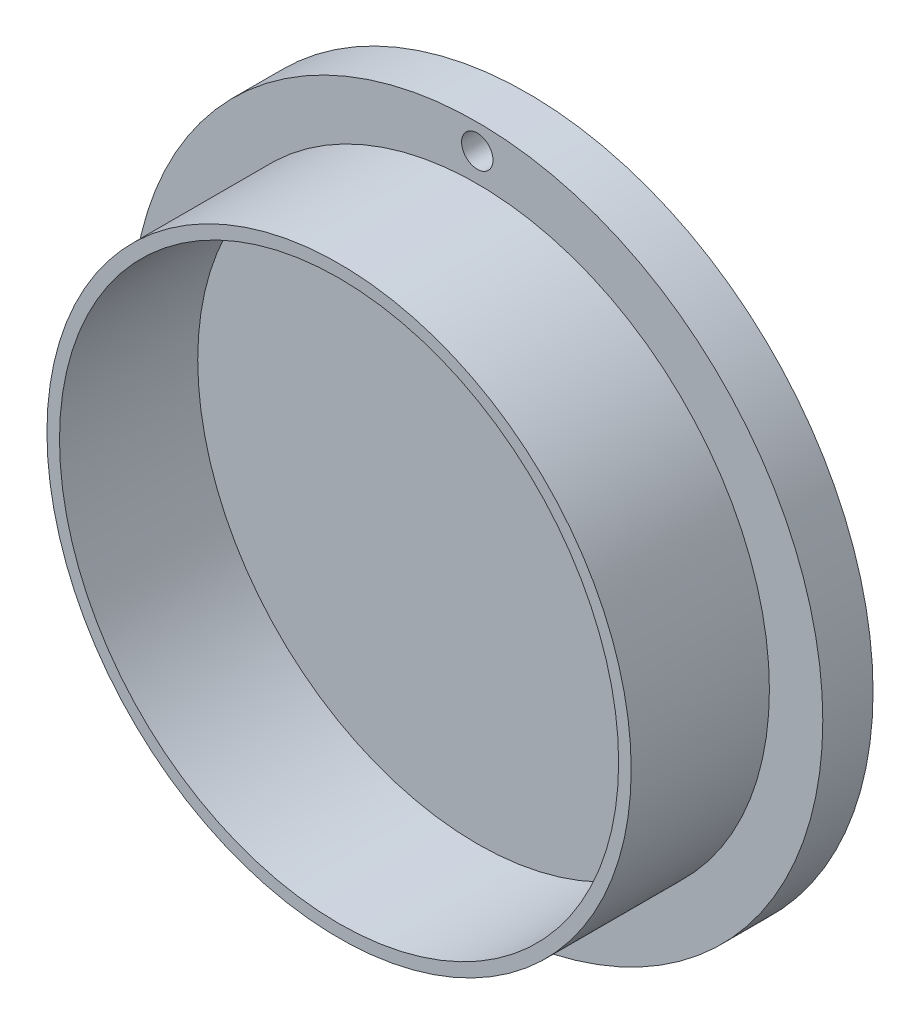
ISO-10303-21;
HEADER;
FILE_DESCRIPTION(('STEP AP214'),'2;1');
FILE_NAME('part.step','',(''),(''),'','','');
FILE_SCHEMA(('AUTOMOTIVE_DESIGN { 1 0 10303 214 1 1 1 1 }'));
ENDSEC;
DATA;
#1=APPLICATION_CONTEXT('core data for automotive mechanical design processes');
#2=APPLICATION_PROTOCOL_DEFINITION('international standard','automotive_design',2000,#1);
#3=PRODUCT_CONTEXT('',#1,'mechanical');
#4=PRODUCT('Part','Part','',(#3));
#5=PRODUCT_RELATED_PRODUCT_CATEGORY('part','',(#4));
#6=PRODUCT_DEFINITION_FORMATION('','',#4);
#7=PRODUCT_DEFINITION_CONTEXT('part definition',#1,'design');
#8=PRODUCT_DEFINITION('design','',#6,#7);
#9=PRODUCT_DEFINITION_SHAPE('','',#8);
#10=(LENGTH_UNIT() NAMED_UNIT(*) SI_UNIT(.MILLI.,.METRE.));
#11=(NAMED_UNIT(*) PLANE_ANGLE_UNIT() SI_UNIT($,.RADIAN.));
#12=(NAMED_UNIT(*) SI_UNIT($,.STERADIAN.) SOLID_ANGLE_UNIT());
#13=UNCERTAINTY_MEASURE_WITH_UNIT(LENGTH_MEASURE(1.E-05),#10,'distance_accuracy_value','');
#14=(GEOMETRIC_REPRESENTATION_CONTEXT(3) GLOBAL_UNCERTAINTY_ASSIGNED_CONTEXT((#13)) GLOBAL_UNIT_ASSIGNED_CONTEXT((#10,
#11,#12)) REPRESENTATION_CONTEXT('',''));
#15=CARTESIAN_POINT('',(0.,0.,0.));
#16=DIRECTION('',(0.,0.,1.));
#17=DIRECTION('',(1.,0.,0.));
#18=AXIS2_PLACEMENT_3D('',#15,#16,#17);
#19=CARTESIAN_POINT('',(0.,0.,30.));
#20=DIRECTION('',(0.,0.,-1.));
#21=DIRECTION('',(-1.,0.,0.));
#22=AXIS2_PLACEMENT_3D('',#19,#20,#21);
#23=CYLINDRICAL_SURFACE('',#22,46.5);
#24=CARTESIAN_POINT('',(0.,0.,8.));
#25=DIRECTION('',(0.,0.,1.));
#26=DIRECTION('',(1.,0.,0.));
#27=AXIS2_PLACEMENT_3D('',#24,#25,#26);
#28=CIRCLE('',#27,46.5);
#29=CARTESIAN_POINT('',(46.5,0.,8.));
#30=VERTEX_POINT('',#29);
#31=EDGE_CURVE('E51',#30,#30,#28,.T.);
#32=ORIENTED_EDGE('',*,*,#31,.T.);
#33=EDGE_LOOP('',(#32));
#34=FACE_BOUND('',#33,.T.);
#35=CARTESIAN_POINT('',(0.,0.,30.));
#36=DIRECTION('',(0.,0.,1.));
#37=DIRECTION('',(1.,0.,0.));
#38=AXIS2_PLACEMENT_3D('',#35,#36,#37);
#39=CIRCLE('',#38,46.5);
#40=CARTESIAN_POINT('',(46.5,0.,30.));
#41=VERTEX_POINT('',#40);
#42=EDGE_CURVE('E10',#41,#41,#39,.T.);
#43=ORIENTED_EDGE('',*,*,#42,.F.);
#44=EDGE_LOOP('',(#43));
#45=FACE_BOUND('',#44,.T.);
#46=ADVANCED_FACE('F41',(#34,#45),#23,.T.);
#47=CARTESIAN_POINT('',(0.,0.,30.));
#48=DIRECTION('',(0.,0.,1.));
#49=DIRECTION('',(1.,0.,0.));
#50=AXIS2_PLACEMENT_3D('',#47,#48,#49);
#51=PLANE('',#50);
#52=CARTESIAN_POINT('',(0.,0.,30.));
#53=DIRECTION('',(0.,0.,1.));
#54=DIRECTION('',(1.,0.,0.));
#55=AXIS2_PLACEMENT_3D('',#52,#53,#54);
#56=CIRCLE('',#55,44.5);
#57=CARTESIAN_POINT('',(44.5,0.,30.));
#58=VERTEX_POINT('',#57);
#59=EDGE_CURVE('E77',#58,#58,#56,.T.);
#60=ORIENTED_EDGE('',*,*,#59,.F.);
#61=EDGE_LOOP('',(#60));
#62=FACE_BOUND('',#61,.T.);
#63=ORIENTED_EDGE('',*,*,#42,.T.);
#64=EDGE_LOOP('',(#63));
#65=FACE_BOUND('',#64,.T.);
#66=ADVANCED_FACE('F92',(#62,#65),#51,.T.);
#67=CARTESIAN_POINT('',(0.,0.,8.));
#68=DIRECTION('',(0.,0.,-1.));
#69=DIRECTION('',(-1.,0.,0.));
#70=AXIS2_PLACEMENT_3D('',#67,#68,#69);
#71=CYLINDRICAL_SURFACE('',#70,55.);
#72=CARTESIAN_POINT('',(0.,0.,8.));
#73=DIRECTION('',(0.,0.,1.));
#74=DIRECTION('',(1.,0.,0.));
#75=AXIS2_PLACEMENT_3D('',#72,#73,#74);
#76=CIRCLE('',#75,55.);
#77=CARTESIAN_POINT('',(55.,0.,8.));
#78=VERTEX_POINT('',#77);
#79=EDGE_CURVE('E47',#78,#78,#76,.T.);
#80=ORIENTED_EDGE('',*,*,#79,.F.);
#81=EDGE_LOOP('',(#80));
#82=FACE_BOUND('',#81,.T.);
#83=CARTESIAN_POINT('',(0.,0.,0.));
#84=DIRECTION('',(0.,0.,1.));
#85=DIRECTION('',(1.,0.,0.));
#86=AXIS2_PLACEMENT_3D('',#83,#84,#85);
#87=CIRCLE('',#86,55.);
#88=CARTESIAN_POINT('',(55.,0.,0.));
#89=VERTEX_POINT('',#88);
#90=EDGE_CURVE('E56',#89,#89,#87,.T.);
#91=ORIENTED_EDGE('',*,*,#90,.T.);
#92=EDGE_LOOP('',(#91));
#93=FACE_BOUND('',#92,.T.);
#94=ADVANCED_FACE('F94',(#82,#93),#71,.T.);
#95=CARTESIAN_POINT('',(0.,0.,8.));
#96=DIRECTION('',(0.,0.,1.));
#97=DIRECTION('',(1.,0.,0.));
#98=AXIS2_PLACEMENT_3D('',#95,#96,#97);
#99=PLANE('',#98);
#100=CARTESIAN_POINT('',(0.,51.,8.));
#101=DIRECTION('',(0.,0.,1.));
#102=DIRECTION('',(1.,0.,0.));
#103=AXIS2_PLACEMENT_3D('',#100,#101,#102);
#104=CIRCLE('',#103,2.5);
#105=CARTESIAN_POINT('',(2.5,51.,8.));
#106=VERTEX_POINT('',#105);
#107=EDGE_CURVE('E60',#106,#106,#104,.T.);
#108=ORIENTED_EDGE('',*,*,#107,.F.);
#109=EDGE_LOOP('',(#108));
#110=FACE_BOUND('',#109,.T.);
#111=CARTESIAN_POINT('',(0.,-51.,8.));
#112=DIRECTION('',(0.,0.,1.));
#113=DIRECTION('',(1.,0.,0.));
#114=AXIS2_PLACEMENT_3D('',#111,#112,#113);
#115=CIRCLE('',#114,2.5);
#116=CARTESIAN_POINT('',(2.5,-51.,8.));
#117=VERTEX_POINT('',#116);
#118=EDGE_CURVE('E64',#117,#117,#115,.T.);
#119=ORIENTED_EDGE('',*,*,#118,.F.);
#120=EDGE_LOOP('',(#119));
#121=FACE_BOUND('',#120,.T.);
#122=ORIENTED_EDGE('',*,*,#31,.F.);
#123=EDGE_LOOP('',(#122));
#124=FACE_BOUND('',#123,.T.);
#125=ORIENTED_EDGE('',*,*,#79,.T.);
#126=EDGE_LOOP('',(#125));
#127=FACE_BOUND('',#126,.T.);
#128=ADVANCED_FACE('F100',(#110,#121,#124,#127),#99,.T.);
#129=CARTESIAN_POINT('',(0.,0.,0.));
#130=DIRECTION('',(0.,0.,1.));
#131=DIRECTION('',(1.,0.,0.));
#132=AXIS2_PLACEMENT_3D('',#129,#130,#131);
#133=PLANE('',#132);
#134=CARTESIAN_POINT('',(0.,51.,0.));
#135=DIRECTION('',(0.,0.,1.));
#136=DIRECTION('',(1.,0.,0.));
#137=AXIS2_PLACEMENT_3D('',#134,#135,#136);
#138=CIRCLE('',#137,2.5);
#139=CARTESIAN_POINT('',(2.5,51.,0.));
#140=VERTEX_POINT('',#139);
#141=EDGE_CURVE('E68',#140,#140,#138,.T.);
#142=ORIENTED_EDGE('',*,*,#141,.T.);
#143=EDGE_LOOP('',(#142));
#144=FACE_BOUND('',#143,.T.);
#145=CARTESIAN_POINT('',(0.,-51.,0.));
#146=DIRECTION('',(0.,0.,1.));
#147=DIRECTION('',(1.,0.,0.));
#148=AXIS2_PLACEMENT_3D('',#145,#146,#147);
#149=CIRCLE('',#148,2.5);
#150=CARTESIAN_POINT('',(2.5,-51.,0.));
#151=VERTEX_POINT('',#150);
#152=EDGE_CURVE('E71',#151,#151,#149,.T.);
#153=ORIENTED_EDGE('',*,*,#152,.T.);
#154=EDGE_LOOP('',(#153));
#155=FACE_BOUND('',#154,.T.);
#156=ORIENTED_EDGE('',*,*,#90,.F.);
#157=EDGE_LOOP('',(#156));
#158=FACE_BOUND('',#157,.T.);
#159=ADVANCED_FACE('F105',(#144,#155,#158),#133,.F.);
#160=CARTESIAN_POINT('',(0.,-51.,0.));
#161=DIRECTION('',(0.,0.,1.));
#162=DIRECTION('',(1.,0.,0.));
#163=AXIS2_PLACEMENT_3D('',#160,#161,#162);
#164=CYLINDRICAL_SURFACE('',#163,2.5);
#165=ORIENTED_EDGE('',*,*,#118,.T.);
#166=EDGE_LOOP('',(#165));
#167=FACE_BOUND('',#166,.T.);
#168=ORIENTED_EDGE('',*,*,#152,.F.);
#169=EDGE_LOOP('',(#168));
#170=FACE_BOUND('',#169,.T.);
#171=ADVANCED_FACE('F107',(#167,#170),#164,.F.);
#172=CARTESIAN_POINT('',(0.,51.,0.));
#173=DIRECTION('',(0.,0.,1.));
#174=DIRECTION('',(1.,0.,0.));
#175=AXIS2_PLACEMENT_3D('',#172,#173,#174);
#176=CYLINDRICAL_SURFACE('',#175,2.5);
#177=ORIENTED_EDGE('',*,*,#107,.T.);
#178=EDGE_LOOP('',(#177));
#179=FACE_BOUND('',#178,.T.);
#180=ORIENTED_EDGE('',*,*,#141,.F.);
#181=EDGE_LOOP('',(#180));
#182=FACE_BOUND('',#181,.T.);
#183=ADVANCED_FACE('F88',(#179,#182),#176,.F.);
#184=CARTESIAN_POINT('',(0.,0.,8.));
#185=DIRECTION('',(0.,0.,1.));
#186=DIRECTION('',(1.,0.,0.));
#187=AXIS2_PLACEMENT_3D('',#184,#185,#186);
#188=CYLINDRICAL_SURFACE('',#187,44.5);
#189=CARTESIAN_POINT('',(0.,0.,8.));
#190=DIRECTION('',(0.,0.,1.));
#191=DIRECTION('',(1.,0.,0.));
#192=AXIS2_PLACEMENT_3D('',#189,#190,#191);
#193=CIRCLE('',#192,44.5);
#194=CARTESIAN_POINT('',(44.5,0.,8.));
#195=VERTEX_POINT('',#194);
#196=EDGE_CURVE('E74',#195,#195,#193,.T.);
#197=ORIENTED_EDGE('',*,*,#196,.F.);
#198=EDGE_LOOP('',(#197));
#199=FACE_BOUND('',#198,.T.);
#200=ORIENTED_EDGE('',*,*,#59,.T.);
#201=EDGE_LOOP('',(#200));
#202=FACE_BOUND('',#201,.T.);
#203=ADVANCED_FACE('F85',(#199,#202),#188,.F.);
#204=CARTESIAN_POINT('',(0.,0.,8.));
#205=DIRECTION('',(0.,0.,1.));
#206=DIRECTION('',(1.,0.,0.));
#207=AXIS2_PLACEMENT_3D('',#204,#205,#206);
#208=PLANE('',#207);
#209=ORIENTED_EDGE('',*,*,#196,.T.);
#210=EDGE_LOOP('',(#209));
#211=FACE_BOUND('',#210,.T.);
#212=ADVANCED_FACE('F83',(#211),#208,.T.);
#213=CLOSED_SHELL('',(#46,#66,#94,#128,#159,#171,#183,#203,#212));
#214=MANIFOLD_SOLID_BREP('B2',#213);
#215=ADVANCED_BREP_SHAPE_REPRESENTATION('',(#18,#214),#14);
#216=SHAPE_DEFINITION_REPRESENTATION(#9,#215);
ENDSEC;
END-ISO-10303-21;
